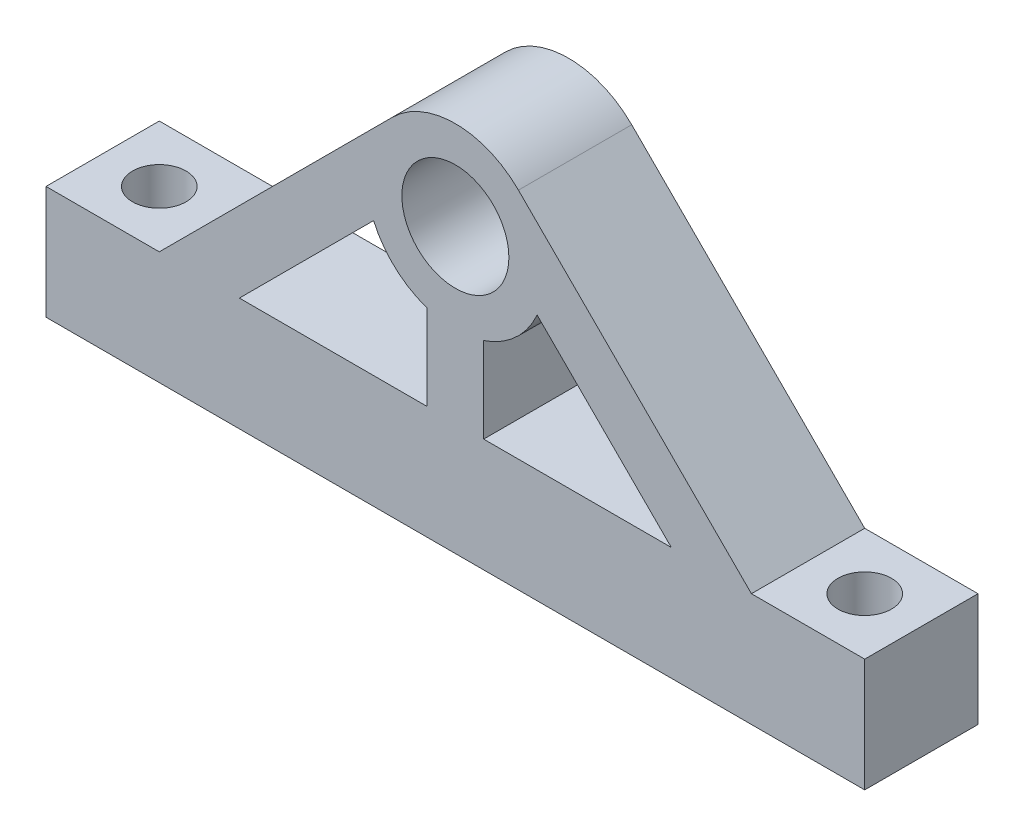
ISO-10303-21;
HEADER;
FILE_DESCRIPTION(('STEP AP214'),'2;1');
FILE_NAME('part.step','',(''),(''),'','','');
FILE_SCHEMA(('AUTOMOTIVE_DESIGN { 1 0 10303 214 1 1 1 1 }'));
ENDSEC;
DATA;
#1=APPLICATION_CONTEXT('core data for automotive mechanical design processes');
#2=APPLICATION_PROTOCOL_DEFINITION('international standard','automotive_design',2000,#1);
#3=PRODUCT_CONTEXT('',#1,'mechanical');
#4=PRODUCT('Part','Part','',(#3));
#5=PRODUCT_RELATED_PRODUCT_CATEGORY('part','',(#4));
#6=PRODUCT_DEFINITION_FORMATION('','',#4);
#7=PRODUCT_DEFINITION_CONTEXT('part definition',#1,'design');
#8=PRODUCT_DEFINITION('design','',#6,#7);
#9=PRODUCT_DEFINITION_SHAPE('','',#8);
#10=(LENGTH_UNIT() NAMED_UNIT(*) SI_UNIT(.MILLI.,.METRE.));
#11=(NAMED_UNIT(*) PLANE_ANGLE_UNIT() SI_UNIT($,.RADIAN.));
#12=(NAMED_UNIT(*) SI_UNIT($,.STERADIAN.) SOLID_ANGLE_UNIT());
#13=UNCERTAINTY_MEASURE_WITH_UNIT(LENGTH_MEASURE(1.E-05),#10,'distance_accuracy_value','');
#14=(GEOMETRIC_REPRESENTATION_CONTEXT(3) GLOBAL_UNCERTAINTY_ASSIGNED_CONTEXT((#13)) GLOBAL_UNIT_ASSIGNED_CONTEXT((#10,
#11,#12)) REPRESENTATION_CONTEXT('',''));
#15=CARTESIAN_POINT('',(0.,0.,0.));
#16=DIRECTION('',(0.,0.,1.));
#17=DIRECTION('',(1.,0.,0.));
#18=AXIS2_PLACEMENT_3D('',#15,#16,#17);
#19=CARTESIAN_POINT('',(3.53553390593273,3.53553390593274,6.35));
#20=DIRECTION('',(0.707106781186546,0.707106781186549,0.));
#21=DIRECTION('',(-0.707106781186549,0.707106781186546,0.));
#22=AXIS2_PLACEMENT_3D('',#19,#20,#21);
#23=PLANE('',#22);
#24=DIRECTION('',(0.707106781186549,-0.707106781186546,0.));
#25=VECTOR('',#24,1.);
#26=CARTESIAN_POINT('',(3.53553390593273,3.53553390593274,0.));
#27=LINE('',#26,#25);
#28=CARTESIAN_POINT('',(3.53553390593273,3.53553390593274,0.));
#29=VERTEX_POINT('',#28);
#30=CARTESIAN_POINT('',(16.5960678118655,-9.525,0.));
#31=VERTEX_POINT('',#30);
#32=EDGE_CURVE('E242',#29,#31,#27,.T.);
#33=ORIENTED_EDGE('',*,*,#32,.F.);
#34=DIRECTION('',(0.,0.,-1.));
#35=VECTOR('',#34,1.);
#36=CARTESIAN_POINT('',(3.53553390593273,3.53553390593274,6.35));
#37=LINE('',#36,#35);
#38=CARTESIAN_POINT('',(3.53553390593273,3.53553390593274,6.35));
#39=VERTEX_POINT('',#38);
#40=EDGE_CURVE('E11',#39,#29,#37,.T.);
#41=ORIENTED_EDGE('',*,*,#40,.F.);
#42=DIRECTION('',(0.707106781186549,-0.707106781186546,0.));
#43=VECTOR('',#42,1.);
#44=CARTESIAN_POINT('',(3.53553390593273,3.53553390593274,6.35));
#45=LINE('',#44,#43);
#46=CARTESIAN_POINT('',(16.5960678118655,-9.525,6.35));
#47=VERTEX_POINT('',#46);
#48=EDGE_CURVE('E289',#39,#47,#45,.T.);
#49=ORIENTED_EDGE('',*,*,#48,.T.);
#50=DIRECTION('',(0.,0.,-1.));
#51=VECTOR('',#50,1.);
#52=CARTESIAN_POINT('',(16.5960678118655,-9.525,6.35));
#53=LINE('',#52,#51);
#54=EDGE_CURVE('E52',#47,#31,#53,.T.);
#55=ORIENTED_EDGE('',*,*,#54,.T.);
#56=EDGE_LOOP('',(#33,#41,#49,#55));
#57=FACE_BOUND('',#56,.T.);
#58=ADVANCED_FACE('F33',(#57),#23,.T.);
#59=CARTESIAN_POINT('',(0.,0.,6.35));
#60=DIRECTION('',(0.,0.,-1.));
#61=DIRECTION('',(-1.,0.,0.));
#62=AXIS2_PLACEMENT_3D('',#59,#60,#61);
#63=CYLINDRICAL_SURFACE('',#62,5.);
#64=CARTESIAN_POINT('',(0.,0.,0.));
#65=DIRECTION('',(0.,0.,1.));
#66=DIRECTION('',(1.,0.,0.));
#67=AXIS2_PLACEMENT_3D('',#64,#65,#66);
#68=CIRCLE('',#67,5.);
#69=CARTESIAN_POINT('',(-3.53553390593273,3.53553390593274,0.));
#70=VERTEX_POINT('',#69);
#71=EDGE_CURVE('E231',#29,#70,#68,.T.);
#72=ORIENTED_EDGE('',*,*,#71,.T.);
#73=DIRECTION('',(0.,0.,-1.));
#74=VECTOR('',#73,1.);
#75=CARTESIAN_POINT('',(-3.53553390593273,3.53553390593274,6.35));
#76=LINE('',#75,#74);
#77=CARTESIAN_POINT('',(-3.53553390593273,3.53553390593274,6.35));
#78=VERTEX_POINT('',#77);
#79=EDGE_CURVE('E43',#78,#70,#76,.T.);
#80=ORIENTED_EDGE('',*,*,#79,.F.);
#81=CARTESIAN_POINT('',(0.,0.,6.35));
#82=DIRECTION('',(0.,0.,1.));
#83=DIRECTION('',(1.,0.,0.));
#84=AXIS2_PLACEMENT_3D('',#81,#82,#83);
#85=CIRCLE('',#84,5.);
#86=EDGE_CURVE('E291',#39,#78,#85,.T.);
#87=ORIENTED_EDGE('',*,*,#86,.F.);
#88=ORIENTED_EDGE('',*,*,#40,.T.);
#89=EDGE_LOOP('',(#72,#80,#87,#88));
#90=FACE_BOUND('',#89,.T.);
#91=ADVANCED_FACE('F287',(#90),#63,.T.);
#92=CARTESIAN_POINT('',(-3.53553390593273,3.53553390593274,6.35));
#93=DIRECTION('',(0.707106781186546,-0.707106781186549,0.));
#94=DIRECTION('',(0.707106781186549,0.707106781186546,0.));
#95=AXIS2_PLACEMENT_3D('',#92,#93,#94);
#96=PLANE('',#95);
#97=DIRECTION('',(-0.707106781186549,-0.707106781186546,0.));
#98=VECTOR('',#97,1.);
#99=CARTESIAN_POINT('',(-3.53553390593273,3.53553390593274,0.));
#100=LINE('',#99,#98);
#101=CARTESIAN_POINT('',(-16.5960678118655,-9.525,0.));
#102=VERTEX_POINT('',#101);
#103=EDGE_CURVE('E244',#70,#102,#100,.T.);
#104=ORIENTED_EDGE('',*,*,#103,.T.);
#105=DIRECTION('',(0.,0.,-1.));
#106=VECTOR('',#105,1.);
#107=CARTESIAN_POINT('',(-16.5960678118655,-9.525,6.35));
#108=LINE('',#107,#106);
#109=CARTESIAN_POINT('',(-16.5960678118655,-9.525,6.35));
#110=VERTEX_POINT('',#109);
#111=EDGE_CURVE('E185',#110,#102,#108,.T.);
#112=ORIENTED_EDGE('',*,*,#111,.F.);
#113=DIRECTION('',(-0.707106781186549,-0.707106781186546,0.));
#114=VECTOR('',#113,1.);
#115=CARTESIAN_POINT('',(-3.53553390593273,3.53553390593274,6.35));
#116=LINE('',#115,#114);
#117=EDGE_CURVE('E292',#78,#110,#116,.T.);
#118=ORIENTED_EDGE('',*,*,#117,.F.);
#119=ORIENTED_EDGE('',*,*,#79,.T.);
#120=EDGE_LOOP('',(#104,#112,#118,#119));
#121=FACE_BOUND('',#120,.T.);
#122=ADVANCED_FACE('F336',(#121),#96,.F.);
#123=CARTESIAN_POINT('',(0.,-9.525,6.35));
#124=DIRECTION('',(0.,1.,0.));
#125=DIRECTION('',(0.,0.,1.));
#126=AXIS2_PLACEMENT_3D('',#123,#124,#125);
#127=PLANE('',#126);
#128=CARTESIAN_POINT('',(-19.7710678118655,-9.525,3.175));
#129=DIRECTION('',(0.,1.,0.));
#130=DIRECTION('',(0.,0.,1.));
#131=AXIS2_PLACEMENT_3D('',#128,#129,#130);
#132=CIRCLE('',#131,1.49999999999999);
#133=CARTESIAN_POINT('',(-19.7710678118655,-9.525,4.67499999999999));
#134=VERTEX_POINT('',#133);
#135=EDGE_CURVE('E370',#134,#134,#132,.T.);
#136=ORIENTED_EDGE('',*,*,#135,.F.);
#137=EDGE_LOOP('',(#136));
#138=FACE_BOUND('',#137,.T.);
#139=DIRECTION('',(1.,0.,0.));
#140=VECTOR('',#139,1.);
#141=CARTESIAN_POINT('',(0.,-9.525,0.));
#142=LINE('',#141,#140);
#143=CARTESIAN_POINT('',(-22.9460678118655,-9.525,0.));
#144=VERTEX_POINT('',#143);
#145=EDGE_CURVE('E247',#144,#102,#142,.T.);
#146=ORIENTED_EDGE('',*,*,#145,.F.);
#147=DIRECTION('',(0.,0.,-1.));
#148=VECTOR('',#147,1.);
#149=CARTESIAN_POINT('',(-22.9460678118655,-9.525,6.35));
#150=LINE('',#149,#148);
#151=CARTESIAN_POINT('',(-22.9460678118655,-9.525,6.35));
#152=VERTEX_POINT('',#151);
#153=EDGE_CURVE('E179',#152,#144,#150,.T.);
#154=ORIENTED_EDGE('',*,*,#153,.F.);
#155=DIRECTION('',(1.,0.,0.));
#156=VECTOR('',#155,1.);
#157=CARTESIAN_POINT('',(0.,-9.525,6.35));
#158=LINE('',#157,#156);
#159=EDGE_CURVE('E301',#152,#110,#158,.T.);
#160=ORIENTED_EDGE('',*,*,#159,.T.);
#161=ORIENTED_EDGE('',*,*,#111,.T.);
#162=EDGE_LOOP('',(#146,#154,#160,#161));
#163=FACE_BOUND('',#162,.T.);
#164=ADVANCED_FACE('F329',(#138,#163),#127,.T.);
#165=CARTESIAN_POINT('',(-22.9460678118655,0.,6.35));
#166=DIRECTION('',(-1.,0.,0.));
#167=DIRECTION('',(0.,0.,1.));
#168=AXIS2_PLACEMENT_3D('',#165,#166,#167);
#169=PLANE('',#168);
#170=DIRECTION('',(0.,1.,0.));
#171=VECTOR('',#170,1.);
#172=CARTESIAN_POINT('',(-22.9460678118655,0.,0.));
#173=LINE('',#172,#171);
#174=CARTESIAN_POINT('',(-22.9460678118655,-15.875,0.));
#175=VERTEX_POINT('',#174);
#176=EDGE_CURVE('E248',#175,#144,#173,.T.);
#177=ORIENTED_EDGE('',*,*,#176,.F.);
#178=DIRECTION('',(0.,0.,-1.));
#179=VECTOR('',#178,1.);
#180=CARTESIAN_POINT('',(-22.9460678118655,-15.875,6.35));
#181=LINE('',#180,#179);
#182=CARTESIAN_POINT('',(-22.9460678118655,-15.875,6.35));
#183=VERTEX_POINT('',#182);
#184=EDGE_CURVE('E177',#183,#175,#181,.T.);
#185=ORIENTED_EDGE('',*,*,#184,.F.);
#186=DIRECTION('',(0.,1.,0.));
#187=VECTOR('',#186,1.);
#188=CARTESIAN_POINT('',(-22.9460678118655,0.,6.35));
#189=LINE('',#188,#187);
#190=EDGE_CURVE('E171',#183,#152,#189,.T.);
#191=ORIENTED_EDGE('',*,*,#190,.T.);
#192=ORIENTED_EDGE('',*,*,#153,.T.);
#193=EDGE_LOOP('',(#177,#185,#191,#192));
#194=FACE_BOUND('',#193,.T.);
#195=ADVANCED_FACE('F358',(#194),#169,.T.);
#196=CARTESIAN_POINT('',(0.,-15.875,6.35));
#197=DIRECTION('',(0.,1.,0.));
#198=DIRECTION('',(0.,0.,1.));
#199=AXIS2_PLACEMENT_3D('',#196,#197,#198);
#200=PLANE('',#199);
#201=CARTESIAN_POINT('',(-19.7710678118655,-15.875,3.175));
#202=DIRECTION('',(0.,1.,0.));
#203=DIRECTION('',(0.,0.,1.));
#204=AXIS2_PLACEMENT_3D('',#201,#202,#203);
#205=CIRCLE('',#204,1.49999999999999);
#206=CARTESIAN_POINT('',(-19.7710678118655,-15.875,4.67499999999999));
#207=VERTEX_POINT('',#206);
#208=EDGE_CURVE('E374',#207,#207,#205,.T.);
#209=ORIENTED_EDGE('',*,*,#208,.T.);
#210=EDGE_LOOP('',(#209));
#211=FACE_BOUND('',#210,.T.);
#212=CARTESIAN_POINT('',(19.7710678118655,-15.875,3.175));
#213=DIRECTION('',(0.,1.,0.));
#214=DIRECTION('',(0.,0.,1.));
#215=AXIS2_PLACEMENT_3D('',#212,#213,#214);
#216=CIRCLE('',#215,1.5);
#217=CARTESIAN_POINT('',(19.7710678118655,-15.875,4.675));
#218=VERTEX_POINT('',#217);
#219=EDGE_CURVE('E221',#218,#218,#216,.T.);
#220=ORIENTED_EDGE('',*,*,#219,.T.);
#221=EDGE_LOOP('',(#220));
#222=FACE_BOUND('',#221,.T.);
#223=DIRECTION('',(1.,0.,0.));
#224=VECTOR('',#223,1.);
#225=CARTESIAN_POINT('',(0.,-15.875,0.));
#226=LINE('',#225,#224);
#227=CARTESIAN_POINT('',(22.9460678118655,-15.875,0.));
#228=VERTEX_POINT('',#227);
#229=EDGE_CURVE('E176',#175,#228,#226,.T.);
#230=ORIENTED_EDGE('',*,*,#229,.T.);
#231=DIRECTION('',(0.,0.,-1.));
#232=VECTOR('',#231,1.);
#233=CARTESIAN_POINT('',(22.9460678118655,-15.875,6.35));
#234=LINE('',#233,#232);
#235=CARTESIAN_POINT('',(22.9460678118655,-15.875,6.35));
#236=VERTEX_POINT('',#235);
#237=EDGE_CURVE('E157',#236,#228,#234,.T.);
#238=ORIENTED_EDGE('',*,*,#237,.F.);
#239=DIRECTION('',(1.,0.,0.));
#240=VECTOR('',#239,1.);
#241=CARTESIAN_POINT('',(0.,-15.875,6.35));
#242=LINE('',#241,#240);
#243=EDGE_CURVE('E162',#183,#236,#242,.T.);
#244=ORIENTED_EDGE('',*,*,#243,.F.);
#245=ORIENTED_EDGE('',*,*,#184,.T.);
#246=EDGE_LOOP('',(#230,#238,#244,#245));
#247=FACE_BOUND('',#246,.T.);
#248=ADVANCED_FACE('F174',(#211,#222,#247),#200,.F.);
#249=CARTESIAN_POINT('',(22.9460678118655,0.,6.35));
#250=DIRECTION('',(-1.,0.,0.));
#251=DIRECTION('',(0.,0.,1.));
#252=AXIS2_PLACEMENT_3D('',#249,#250,#251);
#253=PLANE('',#252);
#254=DIRECTION('',(0.,1.,0.));
#255=VECTOR('',#254,1.);
#256=CARTESIAN_POINT('',(22.9460678118655,0.,0.));
#257=LINE('',#256,#255);
#258=CARTESIAN_POINT('',(22.9460678118655,-9.525,0.));
#259=VERTEX_POINT('',#258);
#260=EDGE_CURVE('E252',#228,#259,#257,.T.);
#261=ORIENTED_EDGE('',*,*,#260,.T.);
#262=DIRECTION('',(0.,0.,-1.));
#263=VECTOR('',#262,1.);
#264=CARTESIAN_POINT('',(22.9460678118655,-9.525,6.35));
#265=LINE('',#264,#263);
#266=CARTESIAN_POINT('',(22.9460678118655,-9.525,6.35));
#267=VERTEX_POINT('',#266);
#268=EDGE_CURVE('E102',#267,#259,#265,.T.);
#269=ORIENTED_EDGE('',*,*,#268,.F.);
#270=DIRECTION('',(0.,1.,0.));
#271=VECTOR('',#270,1.);
#272=CARTESIAN_POINT('',(22.9460678118655,0.,6.35));
#273=LINE('',#272,#271);
#274=EDGE_CURVE('E153',#236,#267,#273,.T.);
#275=ORIENTED_EDGE('',*,*,#274,.F.);
#276=ORIENTED_EDGE('',*,*,#237,.T.);
#277=EDGE_LOOP('',(#261,#269,#275,#276));
#278=FACE_BOUND('',#277,.T.);
#279=ADVANCED_FACE('F155',(#278),#253,.F.);
#280=CARTESIAN_POINT('',(-12.1059397513309,-9.525,0.));
#281=VERTEX_POINT('',#280);
#282=CARTESIAN_POINT('',(-1.5875,-9.525,0.));
#283=VERTEX_POINT('',#282);
#284=EDGE_CURVE('E224',#281,#283,#142,.T.);
#285=ORIENTED_EDGE('',*,*,#284,.F.);
#286=DIRECTION('',(0.,0.,-1.));
#287=VECTOR('',#286,1.);
#288=CARTESIAN_POINT('',(-12.1059397513309,-9.525,6.35));
#289=LINE('',#288,#287);
#290=CARTESIAN_POINT('',(-12.1059397513309,-9.525,6.35));
#291=VERTEX_POINT('',#290);
#292=EDGE_CURVE('E196',#291,#281,#289,.T.);
#293=ORIENTED_EDGE('',*,*,#292,.F.);
#294=CARTESIAN_POINT('',(-1.5875,-9.525,6.35));
#295=VERTEX_POINT('',#294);
#296=EDGE_CURVE('E260',#291,#295,#158,.T.);
#297=ORIENTED_EDGE('',*,*,#296,.T.);
#298=DIRECTION('',(0.,0.,-1.));
#299=VECTOR('',#298,1.);
#300=CARTESIAN_POINT('',(-1.5875,-9.525,6.35));
#301=LINE('',#300,#299);
#302=EDGE_CURVE('E189',#295,#283,#301,.T.);
#303=ORIENTED_EDGE('',*,*,#302,.T.);
#304=EDGE_LOOP('',(#285,#293,#297,#303));
#305=FACE_BOUND('',#304,.T.);
#306=ADVANCED_FACE('F270',(#305),#127,.T.);
#307=CARTESIAN_POINT('',(-1.29046987566545,1.29046987566545,6.35));
#308=DIRECTION('',(0.707106781186546,-0.707106781186549,0.));
#309=DIRECTION('',(0.707106781186549,0.707106781186546,0.));
#310=AXIS2_PLACEMENT_3D('',#307,#308,#309);
#311=PLANE('',#310);
#312=DIRECTION('',(-0.707106781186549,-0.707106781186546,0.));
#313=VECTOR('',#312,1.);
#314=CARTESIAN_POINT('',(-1.29046987566545,1.29046987566545,0.));
#315=LINE('',#314,#313);
#316=CARTESIAN_POINT('',(-4.58207852494319,-2.00113877361228,0.));
#317=VERTEX_POINT('',#316);
#318=EDGE_CURVE('E236',#317,#281,#315,.T.);
#319=ORIENTED_EDGE('',*,*,#318,.F.);
#320=DIRECTION('',(0.,0.,-1.));
#321=VECTOR('',#320,1.);
#322=CARTESIAN_POINT('',(-4.58207852494319,-2.00113877361228,6.35));
#323=LINE('',#322,#321);
#324=CARTESIAN_POINT('',(-4.58207852494319,-2.00113877361228,6.35));
#325=VERTEX_POINT('',#324);
#326=EDGE_CURVE('E194',#325,#317,#323,.T.);
#327=ORIENTED_EDGE('',*,*,#326,.F.);
#328=DIRECTION('',(-0.707106781186549,-0.707106781186546,0.));
#329=VECTOR('',#328,1.);
#330=CARTESIAN_POINT('',(-1.29046987566545,1.29046987566545,6.35));
#331=LINE('',#330,#329);
#332=EDGE_CURVE('E309',#325,#291,#331,.T.);
#333=ORIENTED_EDGE('',*,*,#332,.T.);
#334=ORIENTED_EDGE('',*,*,#292,.T.);
#335=EDGE_LOOP('',(#319,#327,#333,#334));
#336=FACE_BOUND('',#335,.T.);
#337=ADVANCED_FACE('F319',(#336),#311,.T.);
#338=CARTESIAN_POINT('',(-1.5875,-4.74129135890213,0.));
#339=VERTEX_POINT('',#338);
#340=EDGE_CURVE('E232',#317,#339,#68,.T.);
#341=ORIENTED_EDGE('',*,*,#340,.T.);
#342=DIRECTION('',(0.,0.,-1.));
#343=VECTOR('',#342,1.);
#344=CARTESIAN_POINT('',(-1.5875,-4.74129135890213,6.35));
#345=LINE('',#344,#343);
#346=CARTESIAN_POINT('',(-1.5875,-4.74129135890213,6.35));
#347=VERTEX_POINT('',#346);
#348=EDGE_CURVE('E191',#347,#339,#345,.T.);
#349=ORIENTED_EDGE('',*,*,#348,.F.);
#350=EDGE_CURVE('E294',#325,#347,#85,.T.);
#351=ORIENTED_EDGE('',*,*,#350,.F.);
#352=ORIENTED_EDGE('',*,*,#326,.T.);
#353=EDGE_LOOP('',(#341,#349,#351,#352));
#354=FACE_BOUND('',#353,.T.);
#355=ADVANCED_FACE('F282',(#354),#63,.T.);
#356=CARTESIAN_POINT('',(1.5875,-9.525,0.));
#357=VERTEX_POINT('',#356);
#358=CARTESIAN_POINT('',(12.1059397513309,-9.525,0.));
#359=VERTEX_POINT('',#358);
#360=EDGE_CURVE('E215',#357,#359,#142,.T.);
#361=ORIENTED_EDGE('',*,*,#360,.F.);
#362=DIRECTION('',(0.,0.,-1.));
#363=VECTOR('',#362,1.);
#364=CARTESIAN_POINT('',(1.5875,-9.525,6.35));
#365=LINE('',#364,#363);
#366=CARTESIAN_POINT('',(1.5875,-9.525,6.35));
#367=VERTEX_POINT('',#366);
#368=EDGE_CURVE('E37',#367,#357,#365,.T.);
#369=ORIENTED_EDGE('',*,*,#368,.F.);
#370=CARTESIAN_POINT('',(12.1059397513309,-9.525,6.35));
#371=VERTEX_POINT('',#370);
#372=EDGE_CURVE('E256',#367,#371,#158,.T.);
#373=ORIENTED_EDGE('',*,*,#372,.T.);
#374=DIRECTION('',(0.,0.,-1.));
#375=VECTOR('',#374,1.);
#376=CARTESIAN_POINT('',(12.1059397513309,-9.525,6.35));
#377=LINE('',#376,#375);
#378=EDGE_CURVE('E198',#371,#359,#377,.T.);
#379=ORIENTED_EDGE('',*,*,#378,.T.);
#380=EDGE_LOOP('',(#361,#369,#373,#379));
#381=FACE_BOUND('',#380,.T.);
#382=ADVANCED_FACE('F216',(#381),#127,.T.);
#383=CARTESIAN_POINT('',(1.5875,0.,6.35));
#384=DIRECTION('',(1.,0.,0.));
#385=DIRECTION('',(0.,1.,0.));
#386=AXIS2_PLACEMENT_3D('',#383,#384,#385);
#387=PLANE('',#386);
#388=DIRECTION('',(0.,-1.,0.));
#389=VECTOR('',#388,1.);
#390=CARTESIAN_POINT('',(1.5875,0.,0.));
#391=LINE('',#390,#389);
#392=CARTESIAN_POINT('',(1.5875,-4.74129135890213,0.));
#393=VERTEX_POINT('',#392);
#394=EDGE_CURVE('E211',#393,#357,#391,.T.);
#395=ORIENTED_EDGE('',*,*,#394,.F.);
#396=DIRECTION('',(0.,0.,-1.));
#397=VECTOR('',#396,1.);
#398=CARTESIAN_POINT('',(1.5875,-4.74129135890213,6.35));
#399=LINE('',#398,#397);
#400=CARTESIAN_POINT('',(1.5875,-4.74129135890213,6.35));
#401=VERTEX_POINT('',#400);
#402=EDGE_CURVE('E203',#401,#393,#399,.T.);
#403=ORIENTED_EDGE('',*,*,#402,.F.);
#404=DIRECTION('',(0.,-1.,0.));
#405=VECTOR('',#404,1.);
#406=CARTESIAN_POINT('',(1.5875,0.,6.35));
#407=LINE('',#406,#405);
#408=EDGE_CURVE('E213',#401,#367,#407,.T.);
#409=ORIENTED_EDGE('',*,*,#408,.T.);
#410=ORIENTED_EDGE('',*,*,#368,.T.);
#411=EDGE_LOOP('',(#395,#403,#409,#410));
#412=FACE_BOUND('',#411,.T.);
#413=ADVANCED_FACE('F35',(#412),#387,.T.);
#414=CARTESIAN_POINT('',(4.58207852494319,-2.00113877361228,0.));
#415=VERTEX_POINT('',#414);
#416=EDGE_CURVE('E227',#393,#415,#68,.T.);
#417=ORIENTED_EDGE('',*,*,#416,.T.);
#418=DIRECTION('',(0.,0.,-1.));
#419=VECTOR('',#418,1.);
#420=CARTESIAN_POINT('',(4.58207852494319,-2.00113877361228,6.35));
#421=LINE('',#420,#419);
#422=CARTESIAN_POINT('',(4.58207852494319,-2.00113877361228,6.35));
#423=VERTEX_POINT('',#422);
#424=EDGE_CURVE('E200',#423,#415,#421,.T.);
#425=ORIENTED_EDGE('',*,*,#424,.F.);
#426=EDGE_CURVE('E295',#401,#423,#85,.T.);
#427=ORIENTED_EDGE('',*,*,#426,.F.);
#428=ORIENTED_EDGE('',*,*,#402,.T.);
#429=EDGE_LOOP('',(#417,#425,#427,#428));
#430=FACE_BOUND('',#429,.T.);
#431=ADVANCED_FACE('F327',(#430),#63,.T.);
#432=CARTESIAN_POINT('',(19.7710678118655,-9.525,3.175));
#433=DIRECTION('',(0.,1.,0.));
#434=DIRECTION('',(0.,0.,1.));
#435=AXIS2_PLACEMENT_3D('',#432,#433,#434);
#436=CIRCLE('',#435,1.5);
#437=CARTESIAN_POINT('',(19.7710678118655,-9.525,4.675));
#438=VERTEX_POINT('',#437);
#439=EDGE_CURVE('E377',#438,#438,#436,.T.);
#440=ORIENTED_EDGE('',*,*,#439,.F.);
#441=EDGE_LOOP('',(#440));
#442=FACE_BOUND('',#441,.T.);
#443=EDGE_CURVE('E223',#31,#259,#142,.T.);
#444=ORIENTED_EDGE('',*,*,#443,.F.);
#445=ORIENTED_EDGE('',*,*,#54,.F.);
#446=EDGE_CURVE('E161',#47,#267,#158,.T.);
#447=ORIENTED_EDGE('',*,*,#446,.T.);
#448=ORIENTED_EDGE('',*,*,#268,.T.);
#449=EDGE_LOOP('',(#444,#445,#447,#448));
#450=FACE_BOUND('',#449,.T.);
#451=ADVANCED_FACE('F340',(#442,#450),#127,.T.);
#452=CARTESIAN_POINT('',(-1.5875,0.,6.35));
#453=DIRECTION('',(1.,0.,0.));
#454=DIRECTION('',(0.,1.,0.));
#455=AXIS2_PLACEMENT_3D('',#452,#453,#454);
#456=PLANE('',#455);
#457=DIRECTION('',(0.,-1.,0.));
#458=VECTOR('',#457,1.);
#459=CARTESIAN_POINT('',(-1.5875,0.,0.));
#460=LINE('',#459,#458);
#461=EDGE_CURVE('E239',#339,#283,#460,.T.);
#462=ORIENTED_EDGE('',*,*,#461,.T.);
#463=ORIENTED_EDGE('',*,*,#302,.F.);
#464=DIRECTION('',(0.,-1.,0.));
#465=VECTOR('',#464,1.);
#466=CARTESIAN_POINT('',(-1.5875,0.,6.35));
#467=LINE('',#466,#465);
#468=EDGE_CURVE('E278',#347,#295,#467,.T.);
#469=ORIENTED_EDGE('',*,*,#468,.F.);
#470=ORIENTED_EDGE('',*,*,#348,.T.);
#471=EDGE_LOOP('',(#462,#463,#469,#470));
#472=FACE_BOUND('',#471,.T.);
#473=ADVANCED_FACE('F275',(#472),#456,.F.);
#474=CARTESIAN_POINT('',(1.29046987566545,1.29046987566545,6.35));
#475=DIRECTION('',(0.707106781186546,0.707106781186549,0.));
#476=DIRECTION('',(-0.707106781186549,0.707106781186546,0.));
#477=AXIS2_PLACEMENT_3D('',#474,#475,#476);
#478=PLANE('',#477);
#479=DIRECTION('',(0.707106781186549,-0.707106781186546,0.));
#480=VECTOR('',#479,1.);
#481=CARTESIAN_POINT('',(1.29046987566545,1.29046987566545,0.));
#482=LINE('',#481,#480);
#483=EDGE_CURVE('E229',#415,#359,#482,.T.);
#484=ORIENTED_EDGE('',*,*,#483,.T.);
#485=ORIENTED_EDGE('',*,*,#378,.F.);
#486=DIRECTION('',(0.707106781186549,-0.707106781186546,0.));
#487=VECTOR('',#486,1.);
#488=CARTESIAN_POINT('',(1.29046987566545,1.29046987566545,6.35));
#489=LINE('',#488,#487);
#490=EDGE_CURVE('E310',#423,#371,#489,.T.);
#491=ORIENTED_EDGE('',*,*,#490,.F.);
#492=ORIENTED_EDGE('',*,*,#424,.T.);
#493=EDGE_LOOP('',(#484,#485,#491,#492));
#494=FACE_BOUND('',#493,.T.);
#495=ADVANCED_FACE('F339',(#494),#478,.F.);
#496=CARTESIAN_POINT('',(0.,0.,6.35));
#497=DIRECTION('',(0.,0.,-1.));
#498=DIRECTION('',(-1.,0.,0.));
#499=AXIS2_PLACEMENT_3D('',#496,#497,#498);
#500=CYLINDRICAL_SURFACE('',#499,3.);
#501=CARTESIAN_POINT('',(0.,0.,6.35));
#502=DIRECTION('',(0.,0.,1.));
#503=DIRECTION('',(1.,0.,0.));
#504=AXIS2_PLACEMENT_3D('',#501,#502,#503);
#505=CIRCLE('',#504,3.);
#506=CARTESIAN_POINT('',(3.,0.,6.35));
#507=VERTEX_POINT('',#506);
#508=EDGE_CURVE('E201',#507,#507,#505,.T.);
#509=ORIENTED_EDGE('',*,*,#508,.T.);
#510=EDGE_LOOP('',(#509));
#511=FACE_BOUND('',#510,.T.);
#512=CARTESIAN_POINT('',(0.,0.,0.));
#513=DIRECTION('',(0.,0.,1.));
#514=DIRECTION('',(1.,0.,0.));
#515=AXIS2_PLACEMENT_3D('',#512,#513,#514);
#516=CIRCLE('',#515,3.);
#517=CARTESIAN_POINT('',(3.,0.,0.));
#518=VERTEX_POINT('',#517);
#519=EDGE_CURVE('E254',#518,#518,#516,.T.);
#520=ORIENTED_EDGE('',*,*,#519,.F.);
#521=EDGE_LOOP('',(#520));
#522=FACE_BOUND('',#521,.T.);
#523=ADVANCED_FACE('F345',(#511,#522),#500,.F.);
#524=CARTESIAN_POINT('',(0.,0.,6.35));
#525=DIRECTION('',(0.,0.,1.));
#526=DIRECTION('',(1.,0.,0.));
#527=AXIS2_PLACEMENT_3D('',#524,#525,#526);
#528=PLANE('',#527);
#529=ORIENTED_EDGE('',*,*,#372,.F.);
#530=ORIENTED_EDGE('',*,*,#408,.F.);
#531=ORIENTED_EDGE('',*,*,#426,.T.);
#532=ORIENTED_EDGE('',*,*,#490,.T.);
#533=EDGE_LOOP('',(#529,#530,#531,#532));
#534=FACE_BOUND('',#533,.T.);
#535=ORIENTED_EDGE('',*,*,#296,.F.);
#536=ORIENTED_EDGE('',*,*,#332,.F.);
#537=ORIENTED_EDGE('',*,*,#350,.T.);
#538=ORIENTED_EDGE('',*,*,#468,.T.);
#539=EDGE_LOOP('',(#535,#536,#537,#538));
#540=FACE_BOUND('',#539,.T.);
#541=ORIENTED_EDGE('',*,*,#48,.F.);
#542=ORIENTED_EDGE('',*,*,#86,.T.);
#543=ORIENTED_EDGE('',*,*,#117,.T.);
#544=ORIENTED_EDGE('',*,*,#159,.F.);
#545=ORIENTED_EDGE('',*,*,#190,.F.);
#546=ORIENTED_EDGE('',*,*,#243,.T.);
#547=ORIENTED_EDGE('',*,*,#274,.T.);
#548=ORIENTED_EDGE('',*,*,#446,.F.);
#549=EDGE_LOOP('',(#541,#542,#543,#544,#545,#546,#547,#548));
#550=FACE_BOUND('',#549,.T.);
#551=ORIENTED_EDGE('',*,*,#508,.F.);
#552=EDGE_LOOP('',(#551));
#553=FACE_BOUND('',#552,.T.);
#554=ADVANCED_FACE('F167',(#534,#540,#550,#553),#528,.T.);
#555=CARTESIAN_POINT('',(0.,0.,0.));
#556=DIRECTION('',(0.,0.,1.));
#557=DIRECTION('',(1.,0.,0.));
#558=AXIS2_PLACEMENT_3D('',#555,#556,#557);
#559=PLANE('',#558);
#560=ORIENTED_EDGE('',*,*,#360,.T.);
#561=ORIENTED_EDGE('',*,*,#483,.F.);
#562=ORIENTED_EDGE('',*,*,#416,.F.);
#563=ORIENTED_EDGE('',*,*,#394,.T.);
#564=EDGE_LOOP('',(#560,#561,#562,#563));
#565=FACE_BOUND('',#564,.T.);
#566=ORIENTED_EDGE('',*,*,#284,.T.);
#567=ORIENTED_EDGE('',*,*,#461,.F.);
#568=ORIENTED_EDGE('',*,*,#340,.F.);
#569=ORIENTED_EDGE('',*,*,#318,.T.);
#570=EDGE_LOOP('',(#566,#567,#568,#569));
#571=FACE_BOUND('',#570,.T.);
#572=ORIENTED_EDGE('',*,*,#32,.T.);
#573=ORIENTED_EDGE('',*,*,#443,.T.);
#574=ORIENTED_EDGE('',*,*,#260,.F.);
#575=ORIENTED_EDGE('',*,*,#229,.F.);
#576=ORIENTED_EDGE('',*,*,#176,.T.);
#577=ORIENTED_EDGE('',*,*,#145,.T.);
#578=ORIENTED_EDGE('',*,*,#103,.F.);
#579=ORIENTED_EDGE('',*,*,#71,.F.);
#580=EDGE_LOOP('',(#572,#573,#574,#575,#576,#577,#578,#579));
#581=FACE_BOUND('',#580,.T.);
#582=ORIENTED_EDGE('',*,*,#519,.T.);
#583=EDGE_LOOP('',(#582));
#584=FACE_BOUND('',#583,.T.);
#585=ADVANCED_FACE('F225',(#565,#571,#581,#584),#559,.F.);
#586=CARTESIAN_POINT('',(19.7710678118655,-15.875,3.175));
#587=DIRECTION('',(0.,1.,0.));
#588=DIRECTION('',(0.,0.,1.));
#589=AXIS2_PLACEMENT_3D('',#586,#587,#588);
#590=CYLINDRICAL_SURFACE('',#589,1.5);
#591=ORIENTED_EDGE('',*,*,#219,.F.);
#592=EDGE_LOOP('',(#591));
#593=FACE_BOUND('',#592,.T.);
#594=ORIENTED_EDGE('',*,*,#439,.T.);
#595=EDGE_LOOP('',(#594));
#596=FACE_BOUND('',#595,.T.);
#597=ADVANCED_FACE('F383',(#593,#596),#590,.F.);
#598=CARTESIAN_POINT('',(-19.7710678118655,-15.875,3.175));
#599=DIRECTION('',(0.,1.,0.));
#600=DIRECTION('',(0.,0.,1.));
#601=AXIS2_PLACEMENT_3D('',#598,#599,#600);
#602=CYLINDRICAL_SURFACE('',#601,1.49999999999999);
#603=ORIENTED_EDGE('',*,*,#208,.F.);
#604=EDGE_LOOP('',(#603));
#605=FACE_BOUND('',#604,.T.);
#606=ORIENTED_EDGE('',*,*,#135,.T.);
#607=EDGE_LOOP('',(#606));
#608=FACE_BOUND('',#607,.T.);
#609=ADVANCED_FACE('F385',(#605,#608),#602,.F.);
#610=CLOSED_SHELL('',(#58,#91,#122,#164,#195,#248,#279,#306,#337,#355,#382,#413,#431,#451,#473,
#495,#523,#554,#585,#597,#609));
#611=MANIFOLD_SOLID_BREP('B2',#610);
#612=ADVANCED_BREP_SHAPE_REPRESENTATION('',(#18,#611),#14);
#613=SHAPE_DEFINITION_REPRESENTATION(#9,#612);
ENDSEC;
END-ISO-10303-21;
